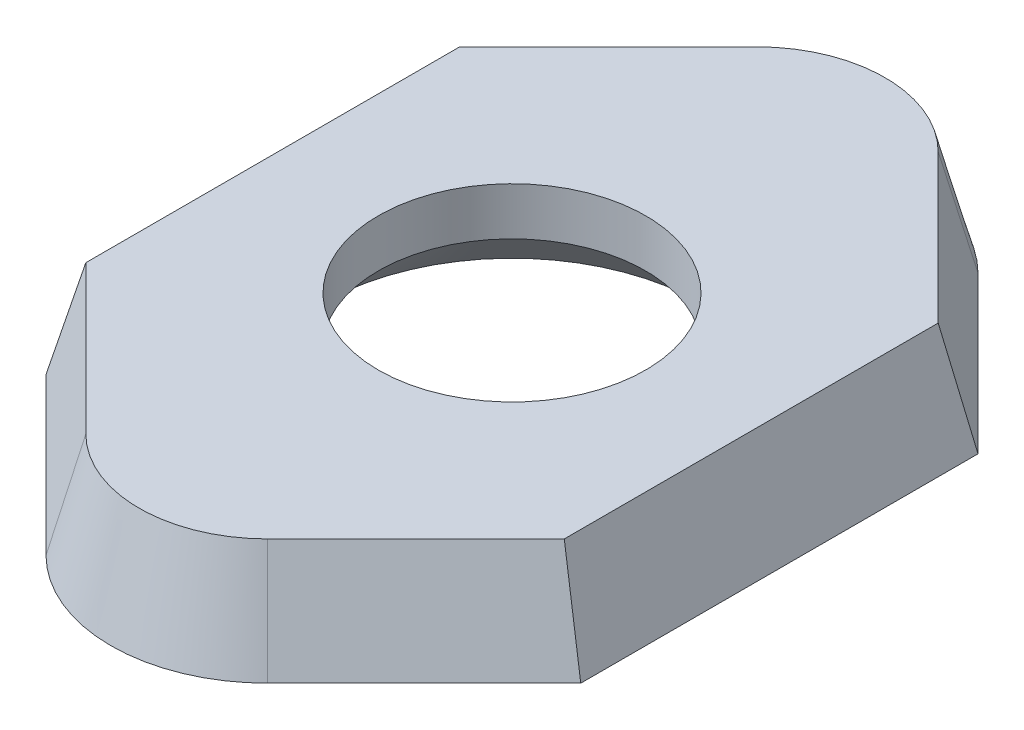
ISO-10303-21;
HEADER;
FILE_DESCRIPTION(('STEP AP214'),'2;1');
FILE_NAME('part.step','',(''),(''),'','','');
FILE_SCHEMA(('AUTOMOTIVE_DESIGN { 1 0 10303 214 1 1 1 1 }'));
ENDSEC;
DATA;
#1=APPLICATION_CONTEXT('core data for automotive mechanical design processes');
#2=APPLICATION_PROTOCOL_DEFINITION('international standard','automotive_design',2000,#1);
#3=PRODUCT_CONTEXT('',#1,'mechanical');
#4=PRODUCT('Part','Part','',(#3));
#5=PRODUCT_RELATED_PRODUCT_CATEGORY('part','',(#4));
#6=PRODUCT_DEFINITION_FORMATION('','',#4);
#7=PRODUCT_DEFINITION_CONTEXT('part definition',#1,'design');
#8=PRODUCT_DEFINITION('design','',#6,#7);
#9=PRODUCT_DEFINITION_SHAPE('','',#8);
#10=(LENGTH_UNIT() NAMED_UNIT(*) SI_UNIT(.MILLI.,.METRE.));
#11=(NAMED_UNIT(*) PLANE_ANGLE_UNIT() SI_UNIT($,.RADIAN.));
#12=(NAMED_UNIT(*) SI_UNIT($,.STERADIAN.) SOLID_ANGLE_UNIT());
#13=UNCERTAINTY_MEASURE_WITH_UNIT(LENGTH_MEASURE(1.E-05),#10,'distance_accuracy_value','');
#14=(GEOMETRIC_REPRESENTATION_CONTEXT(3) GLOBAL_UNCERTAINTY_ASSIGNED_CONTEXT((#13)) GLOBAL_UNIT_ASSIGNED_CONTEXT((#10,
#11,#12)) REPRESENTATION_CONTEXT('',''));
#15=CARTESIAN_POINT('',(0.,0.,0.));
#16=DIRECTION('',(0.,0.,1.));
#17=DIRECTION('',(1.,0.,0.));
#18=AXIS2_PLACEMENT_3D('',#15,#16,#17);
#19=CARTESIAN_POINT('',(0.,-5.11638600407864,0.));
#20=DIRECTION('',(0.,-1.,0.));
#21=DIRECTION('',(0.,0.,-1.));
#22=AXIS2_PLACEMENT_3D('',#19,#20,#21);
#23=CYLINDRICAL_SURFACE('',#22,7.);
#24=CARTESIAN_POINT('',(0.,3.00000000000002,0.));
#25=DIRECTION('',(0.,1.,0.));
#26=DIRECTION('',(0.,0.,1.));
#27=AXIS2_PLACEMENT_3D('',#24,#25,#26);
#28=CIRCLE('',#27,7.);
#29=CARTESIAN_POINT('',(0.,3.00000000000002,7.));
#30=VERTEX_POINT('',#29);
#31=EDGE_CURVE('E11',#30,#30,#28,.F.);
#32=ORIENTED_EDGE('',*,*,#31,.T.);
#33=EDGE_LOOP('',(#32));
#34=FACE_BOUND('',#33,.T.);
#35=CARTESIAN_POINT('',(0.,5.5,0.));
#36=DIRECTION('',(0.,1.,0.));
#37=DIRECTION('',(0.,0.,1.));
#38=AXIS2_PLACEMENT_3D('',#35,#36,#37);
#39=CIRCLE('',#38,7.);
#40=CARTESIAN_POINT('',(0.,5.5,7.));
#41=VERTEX_POINT('',#40);
#42=EDGE_CURVE('E36',#41,#41,#39,.F.);
#43=ORIENTED_EDGE('',*,*,#42,.F.);
#44=EDGE_LOOP('',(#43));
#45=FACE_BOUND('',#44,.T.);
#46=ADVANCED_FACE('F32',(#34,#45),#23,.F.);
#47=CARTESIAN_POINT('',(14.,0.,10.4));
#48=DIRECTION('',(0.683012701892219,0.258819045102521,0.683012701892219));
#49=DIRECTION('',(0.707106781186548,0.,-0.707106781186547));
#50=AXIS2_PLACEMENT_3D('',#47,#48,#49);
#51=PLANE('',#50);
#52=DIRECTION('',(-0.707106781186548,0.,0.707106781186547));
#53=VECTOR('',#52,1.);
#54=CARTESIAN_POINT('',(12.9579221996017,5.5,9.35792219960172));
#55=LINE('',#54,#53);
#56=CARTESIAN_POINT('',(4.75691207282504,5.5,17.5589323263784));
#57=VERTEX_POINT('',#56);
#58=CARTESIAN_POINT('',(12.5262794416288,5.5,9.78956495757461));
#59=VERTEX_POINT('',#58);
#60=EDGE_CURVE('E103',#57,#59,#55,.F.);
#61=ORIENTED_EDGE('',*,*,#60,.F.);
#62=DIRECTION('',(-0.18301270189222,0.965925826289068,-0.18301270189222));
#63=VECTOR('',#62,1.);
#64=CARTESIAN_POINT('',(4.73907738849133,5.59412998127198,17.5410976420447));
#65=LINE('',#64,#63);
#66=CARTESIAN_POINT('',(5.79898987322333,0.,18.6010101267767));
#67=VERTEX_POINT('',#66);
#68=EDGE_CURVE('E112',#57,#67,#65,.F.);
#69=ORIENTED_EDGE('',*,*,#68,.T.);
#70=DIRECTION('',(0.707106781186548,0.,-0.707106781186547));
#71=VECTOR('',#70,1.);
#72=CARTESIAN_POINT('',(14.,0.,10.4));
#73=LINE('',#72,#71);
#74=CARTESIAN_POINT('',(14.,0.,10.4));
#75=VERTEX_POINT('',#74);
#76=EDGE_CURVE('E141',#67,#75,#73,.T.);
#77=ORIENTED_EDGE('',*,*,#76,.T.);
#78=DIRECTION('',(0.257344414215072,-0.960422428894698,0.106595546568842));
#79=VECTOR('',#78,1.);
#80=CARTESIAN_POINT('',(13.4294192154144,2.12943647789612,10.1636577005951));
#81=LINE('',#80,#79);
#82=EDGE_CURVE('E119',#59,#75,#81,.T.);
#83=ORIENTED_EDGE('',*,*,#82,.F.);
#84=EDGE_LOOP('',(#61,#69,#77,#83));
#85=FACE_BOUND('',#84,.T.);
#86=ADVANCED_FACE('F116',(#85),#51,.T.);
#87=CARTESIAN_POINT('',(14.,0.,-10.4));
#88=DIRECTION('',(0.965925826289068,0.258819045102521,0.));
#89=DIRECTION('',(-0.258819045102521,0.965925826289068,0.));
#90=AXIS2_PLACEMENT_3D('',#87,#88,#89);
#91=PLANE('',#90);
#92=DIRECTION('',(0.,0.,-1.));
#93=VECTOR('',#92,1.);
#94=CARTESIAN_POINT('',(14.,0.,-10.4));
#95=LINE('',#94,#93);
#96=CARTESIAN_POINT('',(14.,0.,-10.4));
#97=VERTEX_POINT('',#96);
#98=EDGE_CURVE('E143',#75,#97,#95,.T.);
#99=ORIENTED_EDGE('',*,*,#98,.T.);
#100=DIRECTION('',(0.257344414215072,-0.960422428894698,-0.106595546568843));
#101=VECTOR('',#100,1.);
#102=CARTESIAN_POINT('',(14.,0.,-10.4));
#103=LINE('',#102,#101);
#104=CARTESIAN_POINT('',(12.5262794416288,5.5,-9.78956495757461));
#105=VERTEX_POINT('',#104);
#106=EDGE_CURVE('E155',#105,#97,#103,.T.);
#107=ORIENTED_EDGE('',*,*,#106,.F.);
#108=DIRECTION('',(0.,0.,1.));
#109=VECTOR('',#108,1.);
#110=CARTESIAN_POINT('',(12.5262794416288,5.5,-10.4));
#111=LINE('',#110,#109);
#112=EDGE_CURVE('E121',#59,#105,#111,.F.);
#113=ORIENTED_EDGE('',*,*,#112,.F.);
#114=ORIENTED_EDGE('',*,*,#82,.T.);
#115=EDGE_LOOP('',(#99,#107,#113,#114));
#116=FACE_BOUND('',#115,.T.);
#117=ADVANCED_FACE('F190',(#116),#91,.T.);
#118=CARTESIAN_POINT('',(14.,0.,-10.4));
#119=DIRECTION('',(0.683012701892219,0.258819045102521,-0.683012701892219));
#120=DIRECTION('',(-0.707106781186548,0.,-0.707106781186547));
#121=AXIS2_PLACEMENT_3D('',#118,#119,#120);
#122=PLANE('',#121);
#123=ORIENTED_EDGE('',*,*,#106,.T.);
#124=DIRECTION('',(-0.707106781186548,0.,-0.707106781186547));
#125=VECTOR('',#124,1.);
#126=CARTESIAN_POINT('',(14.,0.,-10.4));
#127=LINE('',#126,#125);
#128=CARTESIAN_POINT('',(5.79898987322334,0.,-18.6010101267767));
#129=VERTEX_POINT('',#128);
#130=EDGE_CURVE('E145',#97,#129,#127,.T.);
#131=ORIENTED_EDGE('',*,*,#130,.T.);
#132=DIRECTION('',(-0.18301270189222,0.965925826289068,0.18301270189222));
#133=VECTOR('',#132,1.);
#134=CARTESIAN_POINT('',(4.73907738849134,5.59412998127198,-17.5410976420446));
#135=LINE('',#134,#133);
#136=CARTESIAN_POINT('',(4.75691207282506,5.5,-17.5589323263784));
#137=VERTEX_POINT('',#136);
#138=EDGE_CURVE('E111',#129,#137,#135,.T.);
#139=ORIENTED_EDGE('',*,*,#138,.T.);
#140=DIRECTION('',(0.707106781186548,0.,0.707106781186547));
#141=VECTOR('',#140,1.);
#142=CARTESIAN_POINT('',(12.9579221996017,5.5,-9.35792219960172));
#143=LINE('',#142,#141);
#144=EDGE_CURVE('E160',#105,#137,#143,.F.);
#145=ORIENTED_EDGE('',*,*,#144,.F.);
#146=EDGE_LOOP('',(#123,#131,#139,#145));
#147=FACE_BOUND('',#146,.T.);
#148=ADVANCED_FACE('F209',(#147),#122,.T.);
#149=CARTESIAN_POINT('',(-5.79898987322333,0.,-18.6010101267767));
#150=DIRECTION('',(-0.683012701892219,0.258819045102521,-0.683012701892219));
#151=DIRECTION('',(-0.707106781186547,0.,0.707106781186548));
#152=AXIS2_PLACEMENT_3D('',#149,#150,#151);
#153=PLANE('',#152);
#154=DIRECTION('',(0.707106781186547,0.,-0.707106781186548));
#155=VECTOR('',#154,1.);
#156=CARTESIAN_POINT('',(-4.75691207282504,5.5,-17.5589323263784));
#157=LINE('',#156,#155);
#158=CARTESIAN_POINT('',(-4.75691207282504,5.5,-17.5589323263784));
#159=VERTEX_POINT('',#158);
#160=CARTESIAN_POINT('',(-12.5262794416288,5.5,-9.7895649575746));
#161=VERTEX_POINT('',#160);
#162=EDGE_CURVE('E162',#159,#161,#157,.F.);
#163=ORIENTED_EDGE('',*,*,#162,.F.);
#164=DIRECTION('',(0.18301270189222,0.965925826289068,0.183012701892219));
#165=VECTOR('',#164,1.);
#166=CARTESIAN_POINT('',(-4.73907738849133,5.59412998127198,-17.5410976420447));
#167=LINE('',#166,#165);
#168=CARTESIAN_POINT('',(-5.79898987322333,0.,-18.6010101267767));
#169=VERTEX_POINT('',#168);
#170=EDGE_CURVE('E56',#169,#159,#167,.T.);
#171=ORIENTED_EDGE('',*,*,#170,.F.);
#172=DIRECTION('',(-0.707106781186547,0.,0.707106781186548));
#173=VECTOR('',#172,1.);
#174=CARTESIAN_POINT('',(-5.79898987322333,0.,-18.6010101267767));
#175=LINE('',#174,#173);
#176=CARTESIAN_POINT('',(-14.,0.,-10.4));
#177=VERTEX_POINT('',#176);
#178=EDGE_CURVE('E147',#169,#177,#175,.T.);
#179=ORIENTED_EDGE('',*,*,#178,.T.);
#180=DIRECTION('',(-0.257344414215072,-0.960422428894698,-0.106595546568842));
#181=VECTOR('',#180,1.);
#182=CARTESIAN_POINT('',(-14.,0.,-10.4));
#183=LINE('',#182,#181);
#184=EDGE_CURVE('E153',#161,#177,#183,.T.);
#185=ORIENTED_EDGE('',*,*,#184,.F.);
#186=EDGE_LOOP('',(#163,#171,#179,#185));
#187=FACE_BOUND('',#186,.T.);
#188=ADVANCED_FACE('F205',(#187),#153,.T.);
#189=CARTESIAN_POINT('',(-14.,0.,-10.4));
#190=DIRECTION('',(-0.965925826289068,0.258819045102521,0.));
#191=DIRECTION('',(-0.258819045102521,-0.965925826289068,0.));
#192=AXIS2_PLACEMENT_3D('',#189,#190,#191);
#193=PLANE('',#192);
#194=DIRECTION('',(0.,0.,1.));
#195=VECTOR('',#194,1.);
#196=CARTESIAN_POINT('',(-14.,0.,-10.4));
#197=LINE('',#196,#195);
#198=CARTESIAN_POINT('',(-14.,0.,10.4));
#199=VERTEX_POINT('',#198);
#200=EDGE_CURVE('E48',#177,#199,#197,.T.);
#201=ORIENTED_EDGE('',*,*,#200,.T.);
#202=DIRECTION('',(-0.257344414215072,-0.960422428894698,0.106595546568842));
#203=VECTOR('',#202,1.);
#204=CARTESIAN_POINT('',(-13.6818469046473,1.18736351644153,10.2682166729939));
#205=LINE('',#204,#203);
#206=CARTESIAN_POINT('',(-12.5262794416288,5.5,9.7895649575746));
#207=VERTEX_POINT('',#206);
#208=EDGE_CURVE('E151',#207,#199,#205,.T.);
#209=ORIENTED_EDGE('',*,*,#208,.F.);
#210=DIRECTION('',(0.,0.,-1.));
#211=VECTOR('',#210,1.);
#212=CARTESIAN_POINT('',(-12.5262794416288,5.5,-10.4));
#213=LINE('',#212,#211);
#214=EDGE_CURVE('E164',#161,#207,#213,.F.);
#215=ORIENTED_EDGE('',*,*,#214,.F.);
#216=ORIENTED_EDGE('',*,*,#184,.T.);
#217=EDGE_LOOP('',(#201,#209,#215,#216));
#218=FACE_BOUND('',#217,.T.);
#219=ADVANCED_FACE('F202',(#218),#193,.T.);
#220=CARTESIAN_POINT('',(-5.79898987322333,0.,18.6010101267767));
#221=DIRECTION('',(-0.683012701892219,0.258819045102521,0.683012701892219));
#222=DIRECTION('',(0.707106781186547,0.,0.707106781186548));
#223=AXIS2_PLACEMENT_3D('',#220,#221,#222);
#224=PLANE('',#223);
#225=ORIENTED_EDGE('',*,*,#208,.T.);
#226=DIRECTION('',(0.707106781186547,0.,0.707106781186548));
#227=VECTOR('',#226,1.);
#228=CARTESIAN_POINT('',(-5.79898987322333,0.,18.6010101267767));
#229=LINE('',#228,#227);
#230=CARTESIAN_POINT('',(-5.79898987322333,0.,18.6010101267767));
#231=VERTEX_POINT('',#230);
#232=EDGE_CURVE('E122',#199,#231,#229,.T.);
#233=ORIENTED_EDGE('',*,*,#232,.T.);
#234=DIRECTION('',(0.18301270189222,0.965925826289068,-0.18301270189222));
#235=VECTOR('',#234,1.);
#236=CARTESIAN_POINT('',(-4.73907738849133,5.59412998127198,17.5410976420447));
#237=LINE('',#236,#235);
#238=CARTESIAN_POINT('',(-4.75691207282504,5.5,17.5589323263784));
#239=VERTEX_POINT('',#238);
#240=EDGE_CURVE('E127',#239,#231,#237,.F.);
#241=ORIENTED_EDGE('',*,*,#240,.F.);
#242=DIRECTION('',(-0.707106781186547,0.,-0.707106781186548));
#243=VECTOR('',#242,1.);
#244=CARTESIAN_POINT('',(-4.75691207282504,5.5,17.5589323263784));
#245=LINE('',#244,#243);
#246=EDGE_CURVE('E106',#207,#239,#245,.F.);
#247=ORIENTED_EDGE('',*,*,#246,.F.);
#248=EDGE_LOOP('',(#225,#233,#241,#247));
#249=FACE_BOUND('',#248,.T.);
#250=ADVANCED_FACE('F199',(#249),#224,.T.);
#251=CARTESIAN_POINT('',(0.,0.,0.));
#252=DIRECTION('',(0.,1.,0.));
#253=DIRECTION('',(0.,0.,1.));
#254=AXIS2_PLACEMENT_3D('',#251,#252,#253);
#255=PLANE('',#254);
#256=CARTESIAN_POINT('',(0.,0.,0.));
#257=DIRECTION('',(0.,1.,0.));
#258=DIRECTION('',(0.,0.,1.));
#259=AXIS2_PLACEMENT_3D('',#256,#257,#258);
#260=CIRCLE('',#259,10.);
#261=CARTESIAN_POINT('',(0.,0.,10.));
#262=VERTEX_POINT('',#261);
#263=EDGE_CURVE('E41',#262,#262,#260,.T.);
#264=ORIENTED_EDGE('',*,*,#263,.T.);
#265=EDGE_LOOP('',(#264));
#266=FACE_BOUND('',#265,.T.);
#267=ORIENTED_EDGE('',*,*,#98,.F.);
#268=ORIENTED_EDGE('',*,*,#76,.F.);
#269=CARTESIAN_POINT('',(0.,0.,12.8020202535533));
#270=DIRECTION('',(0.,-1.,0.));
#271=DIRECTION('',(0.,0.,-1.));
#272=AXIS2_PLACEMENT_3D('',#269,#270,#271);
#273=CIRCLE('',#272,8.20101012677667);
#274=EDGE_CURVE('E126',#67,#231,#273,.T.);
#275=ORIENTED_EDGE('',*,*,#274,.T.);
#276=ORIENTED_EDGE('',*,*,#232,.F.);
#277=ORIENTED_EDGE('',*,*,#200,.F.);
#278=ORIENTED_EDGE('',*,*,#178,.F.);
#279=CARTESIAN_POINT('',(0.,0.,-12.8020202535533));
#280=DIRECTION('',(0.,-1.,0.));
#281=DIRECTION('',(0.,0.,-1.));
#282=AXIS2_PLACEMENT_3D('',#279,#280,#281);
#283=CIRCLE('',#282,8.20101012677667);
#284=EDGE_CURVE('E138',#169,#129,#283,.T.);
#285=ORIENTED_EDGE('',*,*,#284,.T.);
#286=ORIENTED_EDGE('',*,*,#130,.F.);
#287=EDGE_LOOP('',(#267,#268,#275,#276,#277,#278,#285,#286));
#288=FACE_BOUND('',#287,.T.);
#289=ADVANCED_FACE('F170',(#266,#288),#255,.F.);
#290=CARTESIAN_POINT('',(0.,-0.595999999999998,-12.8020202535533));
#291=DIRECTION('',(0.,-1.,0.));
#292=DIRECTION('',(0.,0.,-1.));
#293=AXIS2_PLACEMENT_3D('',#290,#291,#292);
#294=CONICAL_SURFACE('',#293,8.36070784546561,0.26179938779915);
#295=CARTESIAN_POINT('',(0.,5.5,-12.8020202535533));
#296=DIRECTION('',(0.,1.,0.));
#297=DIRECTION('',(0.,0.,1.));
#298=AXIS2_PLACEMENT_3D('',#295,#296,#297);
#299=CIRCLE('',#298,6.72728956840548);
#300=EDGE_CURVE('E134',#159,#137,#299,.F.);
#301=ORIENTED_EDGE('',*,*,#300,.T.);
#302=ORIENTED_EDGE('',*,*,#138,.F.);
#303=ORIENTED_EDGE('',*,*,#284,.F.);
#304=ORIENTED_EDGE('',*,*,#170,.T.);
#305=EDGE_LOOP('',(#301,#302,#303,#304));
#306=FACE_BOUND('',#305,.T.);
#307=ADVANCED_FACE('F181',(#306),#294,.T.);
#308=CARTESIAN_POINT('',(0.,5.59412998127198,12.8020202535533));
#309=DIRECTION('',(0.,-1.,0.));
#310=DIRECTION('',(0.,0.,-1.));
#311=AXIS2_PLACEMENT_3D('',#308,#309,#310);
#312=CONICAL_SURFACE('',#311,6.7020675159401,0.26179938779915);
#313=ORIENTED_EDGE('',*,*,#240,.T.);
#314=ORIENTED_EDGE('',*,*,#274,.F.);
#315=ORIENTED_EDGE('',*,*,#68,.F.);
#316=CARTESIAN_POINT('',(0.,5.5,12.8020202535533));
#317=DIRECTION('',(0.,1.,0.));
#318=DIRECTION('',(0.,0.,1.));
#319=AXIS2_PLACEMENT_3D('',#316,#317,#318);
#320=CIRCLE('',#319,6.72728956840549);
#321=EDGE_CURVE('E100',#239,#57,#320,.T.);
#322=ORIENTED_EDGE('',*,*,#321,.F.);
#323=EDGE_LOOP('',(#313,#314,#315,#322));
#324=FACE_BOUND('',#323,.T.);
#325=ADVANCED_FACE('F124',(#324),#312,.T.);
#326=CARTESIAN_POINT('',(0.,0.,0.));
#327=DIRECTION('',(0.,-1.,0.));
#328=DIRECTION('',(0.,0.,-1.));
#329=AXIS2_PLACEMENT_3D('',#326,#327,#328);
#330=CONICAL_SURFACE('',#329,10.,0.785398163397445);
#331=ORIENTED_EDGE('',*,*,#31,.F.);
#332=EDGE_LOOP('',(#331));
#333=FACE_BOUND('',#332,.T.);
#334=ORIENTED_EDGE('',*,*,#263,.F.);
#335=EDGE_LOOP('',(#334));
#336=FACE_BOUND('',#335,.T.);
#337=ADVANCED_FACE('F34',(#333,#336),#330,.F.);
#338=CARTESIAN_POINT('',(0.,5.5,0.));
#339=DIRECTION('',(0.,1.,0.));
#340=DIRECTION('',(0.,0.,1.));
#341=AXIS2_PLACEMENT_3D('',#338,#339,#340);
#342=PLANE('',#341);
#343=ORIENTED_EDGE('',*,*,#42,.T.);
#344=EDGE_LOOP('',(#343));
#345=FACE_BOUND('',#344,.T.);
#346=ORIENTED_EDGE('',*,*,#112,.T.);
#347=ORIENTED_EDGE('',*,*,#144,.T.);
#348=ORIENTED_EDGE('',*,*,#300,.F.);
#349=ORIENTED_EDGE('',*,*,#162,.T.);
#350=ORIENTED_EDGE('',*,*,#214,.T.);
#351=ORIENTED_EDGE('',*,*,#246,.T.);
#352=ORIENTED_EDGE('',*,*,#321,.T.);
#353=ORIENTED_EDGE('',*,*,#60,.T.);
#354=EDGE_LOOP('',(#346,#347,#348,#349,#350,#351,#352,#353));
#355=FACE_BOUND('',#354,.T.);
#356=ADVANCED_FACE('F102',(#345,#355),#342,.T.);
#357=CLOSED_SHELL('',(#46,#86,#117,#148,#188,#219,#250,#289,#307,#325,#337,#356));
#358=MANIFOLD_SOLID_BREP('B2',#357);
#359=ADVANCED_BREP_SHAPE_REPRESENTATION('',(#18,#358),#14);
#360=SHAPE_DEFINITION_REPRESENTATION(#9,#359);
ENDSEC;
END-ISO-10303-21;
